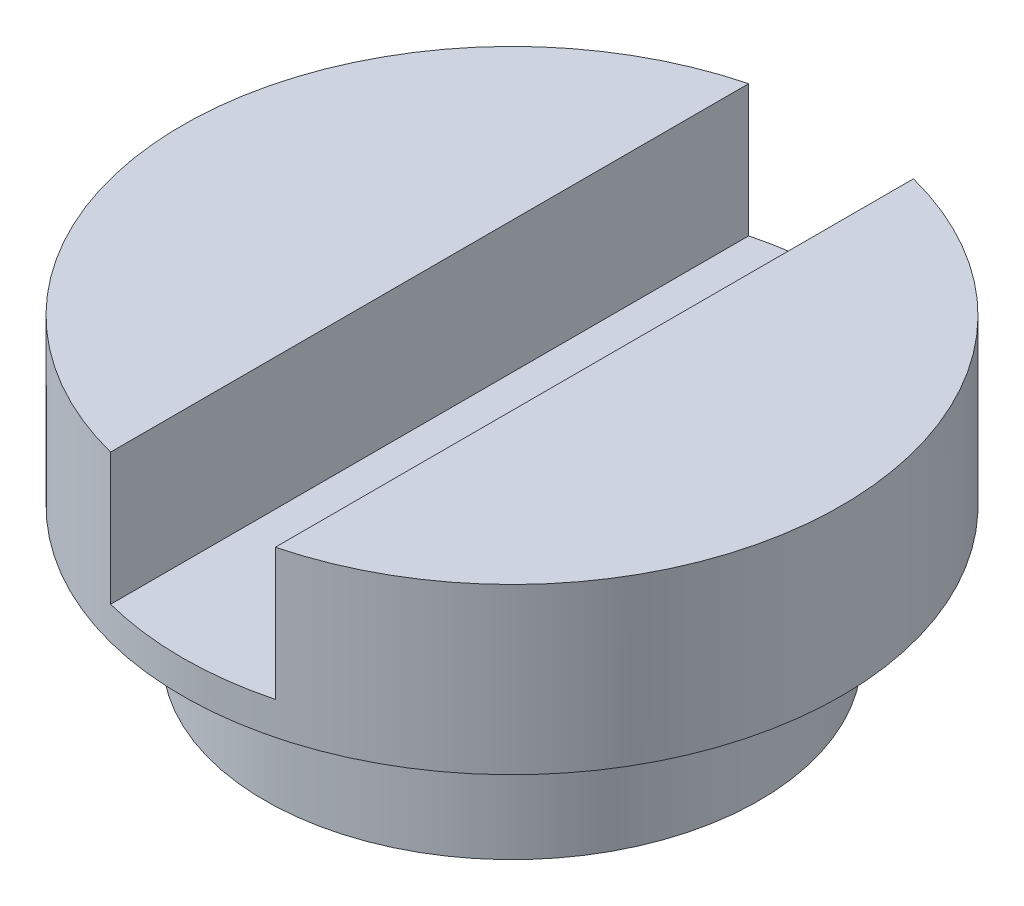
ISO-10303-21;
HEADER;
FILE_DESCRIPTION(('STEP AP214'),'2;1');
FILE_NAME('part.step','',(''),(''),'','','');
FILE_SCHEMA(('AUTOMOTIVE_DESIGN { 1 0 10303 214 1 1 1 1 }'));
ENDSEC;
DATA;
#1=APPLICATION_CONTEXT('core data for automotive mechanical design processes');
#2=APPLICATION_PROTOCOL_DEFINITION('international standard','automotive_design',2000,#1);
#3=PRODUCT_CONTEXT('',#1,'mechanical');
#4=PRODUCT('Part','Part','',(#3));
#5=PRODUCT_RELATED_PRODUCT_CATEGORY('part','',(#4));
#6=PRODUCT_DEFINITION_FORMATION('','',#4);
#7=PRODUCT_DEFINITION_CONTEXT('part definition',#1,'design');
#8=PRODUCT_DEFINITION('design','',#6,#7);
#9=PRODUCT_DEFINITION_SHAPE('','',#8);
#10=(LENGTH_UNIT() NAMED_UNIT(*) SI_UNIT(.MILLI.,.METRE.));
#11=(NAMED_UNIT(*) PLANE_ANGLE_UNIT() SI_UNIT($,.RADIAN.));
#12=(NAMED_UNIT(*) SI_UNIT($,.STERADIAN.) SOLID_ANGLE_UNIT());
#13=UNCERTAINTY_MEASURE_WITH_UNIT(LENGTH_MEASURE(1.E-05),#10,'distance_accuracy_value','');
#14=(GEOMETRIC_REPRESENTATION_CONTEXT(3) GLOBAL_UNCERTAINTY_ASSIGNED_CONTEXT((#13)) GLOBAL_UNIT_ASSIGNED_CONTEXT((#10,
#11,#12)) REPRESENTATION_CONTEXT('',''));
#15=CARTESIAN_POINT('',(0.,0.,0.));
#16=DIRECTION('',(0.,0.,1.));
#17=DIRECTION('',(1.,0.,0.));
#18=AXIS2_PLACEMENT_3D('',#15,#16,#17);
#19=CARTESIAN_POINT('',(174.151440709128,242.076649479877,536.449616024444));
#20=DIRECTION('',(0.,-1.,0.));
#21=DIRECTION('',(0.,0.,-1.));
#22=AXIS2_PLACEMENT_3D('',#19,#20,#21);
#23=PLANE('',#22);
#24=CARTESIAN_POINT('',(174.151440709128,242.076649479877,536.449616024444));
#25=DIRECTION('',(0.,-1.,0.));
#26=DIRECTION('',(0.,0.,-1.));
#27=AXIS2_PLACEMENT_3D('',#24,#25,#26);
#28=CIRCLE('',#27,12.7);
#29=CARTESIAN_POINT('',(174.151440709128,242.076649479877,523.749616024444));
#30=VERTEX_POINT('',#29);
#31=EDGE_CURVE('E11',#30,#30,#28,.T.);
#32=ORIENTED_EDGE('',*,*,#31,.T.);
#33=EDGE_LOOP('',(#32));
#34=FACE_BOUND('',#33,.T.);
#35=CARTESIAN_POINT('',(174.151440709128,242.076649479877,536.449616024444));
#36=DIRECTION('',(0.,-1.,0.));
#37=DIRECTION('',(0.,0.,-1.));
#38=AXIS2_PLACEMENT_3D('',#35,#36,#37);
#39=CIRCLE('',#38,9.52499999999999);
#40=CARTESIAN_POINT('',(174.151440709128,242.076649479877,526.924616024444));
#41=VERTEX_POINT('',#40);
#42=EDGE_CURVE('E137',#41,#41,#39,.T.);
#43=ORIENTED_EDGE('',*,*,#42,.F.);
#44=EDGE_LOOP('',(#43));
#45=FACE_BOUND('',#44,.T.);
#46=ADVANCED_FACE('F33',(#34,#45),#23,.T.);
#47=CARTESIAN_POINT('',(174.151440709128,243.346649479877,536.449616024444));
#48=DIRECTION('',(0.,-1.,0.));
#49=DIRECTION('',(0.,0.,-1.));
#50=AXIS2_PLACEMENT_3D('',#47,#48,#49);
#51=PLANE('',#50);
#52=DIRECTION('',(0.,0.,-1.));
#53=VECTOR('',#52,1.);
#54=CARTESIAN_POINT('',(170.976440709128,243.346649479877,548.746338148653));
#55=LINE('',#54,#53);
#56=CARTESIAN_POINT('',(170.976440709128,243.346649479877,548.746338148653));
#57=VERTEX_POINT('',#56);
#58=CARTESIAN_POINT('',(170.976440709128,243.346649479877,524.152893900236));
#59=VERTEX_POINT('',#58);
#60=EDGE_CURVE('E51',#57,#59,#55,.T.);
#61=ORIENTED_EDGE('',*,*,#60,.F.);
#62=CARTESIAN_POINT('',(174.151440709128,243.346649479877,536.449616024444));
#63=DIRECTION('',(0.,-1.,0.));
#64=DIRECTION('',(0.,0.,-1.));
#65=AXIS2_PLACEMENT_3D('',#62,#63,#64);
#66=CIRCLE('',#65,12.7);
#67=CARTESIAN_POINT('',(177.326440709128,243.346649479877,548.746338148653));
#68=VERTEX_POINT('',#67);
#69=EDGE_CURVE('E43',#68,#57,#66,.T.);
#70=ORIENTED_EDGE('',*,*,#69,.F.);
#71=DIRECTION('',(0.,0.,1.));
#72=VECTOR('',#71,1.);
#73=CARTESIAN_POINT('',(177.326440709128,243.346649479877,524.152893900236));
#74=LINE('',#73,#72);
#75=CARTESIAN_POINT('',(177.326440709128,243.346649479877,524.152893900236));
#76=VERTEX_POINT('',#75);
#77=EDGE_CURVE('E100',#76,#68,#74,.T.);
#78=ORIENTED_EDGE('',*,*,#77,.F.);
#79=EDGE_CURVE('E37',#59,#76,#66,.T.);
#80=ORIENTED_EDGE('',*,*,#79,.F.);
#81=EDGE_LOOP('',(#61,#70,#78,#80));
#82=FACE_BOUND('',#81,.T.);
#83=ADVANCED_FACE('F85',(#82),#51,.F.);
#84=CARTESIAN_POINT('',(174.151440709128,242.076649479877,536.449616024444));
#85=DIRECTION('',(0.,1.,0.));
#86=DIRECTION('',(0.,0.,1.));
#87=AXIS2_PLACEMENT_3D('',#84,#85,#86);
#88=CYLINDRICAL_SURFACE('',#87,12.7);
#89=ORIENTED_EDGE('',*,*,#69,.T.);
#90=DIRECTION('',(0.,-1.,0.));
#91=VECTOR('',#90,1.);
#92=CARTESIAN_POINT('',(170.976440709128,274.800180244642,548.746338148653));
#93=LINE('',#92,#91);
#94=CARTESIAN_POINT('',(170.976440709128,248.426649479877,548.746338148653));
#95=VERTEX_POINT('',#94);
#96=EDGE_CURVE('E77',#95,#57,#93,.T.);
#97=ORIENTED_EDGE('',*,*,#96,.F.);
#98=CARTESIAN_POINT('',(174.151440709128,248.426649479877,536.449616024444));
#99=DIRECTION('',(0.,-1.,0.));
#100=DIRECTION('',(0.,0.,-1.));
#101=AXIS2_PLACEMENT_3D('',#98,#99,#100);
#102=CIRCLE('',#101,12.7);
#103=CARTESIAN_POINT('',(170.976440709128,248.426649479877,524.152893900236));
#104=VERTEX_POINT('',#103);
#105=EDGE_CURVE('E105',#95,#104,#102,.T.);
#106=ORIENTED_EDGE('',*,*,#105,.T.);
#107=DIRECTION('',(0.,-1.,0.));
#108=VECTOR('',#107,1.);
#109=CARTESIAN_POINT('',(170.976440709128,274.800180244642,524.152893900236));
#110=LINE('',#109,#108);
#111=EDGE_CURVE('E82',#104,#59,#110,.T.);
#112=ORIENTED_EDGE('',*,*,#111,.T.);
#113=ORIENTED_EDGE('',*,*,#79,.T.);
#114=DIRECTION('',(0.,-1.,0.));
#115=VECTOR('',#114,1.);
#116=CARTESIAN_POINT('',(177.326440709128,274.800180244642,524.152893900236));
#117=LINE('',#116,#115);
#118=CARTESIAN_POINT('',(177.326440709128,248.426649479877,524.152893900236));
#119=VERTEX_POINT('',#118);
#120=EDGE_CURVE('E99',#119,#76,#117,.T.);
#121=ORIENTED_EDGE('',*,*,#120,.F.);
#122=CARTESIAN_POINT('',(174.151440709128,248.426649479877,536.449616024444));
#123=DIRECTION('',(0.,-1.,0.));
#124=DIRECTION('',(0.,0.,-1.));
#125=AXIS2_PLACEMENT_3D('',#122,#123,#124);
#126=CIRCLE('',#125,12.7);
#127=CARTESIAN_POINT('',(177.326440709128,248.426649479877,548.746338148653));
#128=VERTEX_POINT('',#127);
#129=EDGE_CURVE('E95',#119,#128,#126,.T.);
#130=ORIENTED_EDGE('',*,*,#129,.T.);
#131=DIRECTION('',(0.,-1.,0.));
#132=VECTOR('',#131,1.);
#133=CARTESIAN_POINT('',(177.326440709128,274.800180244642,548.746338148653));
#134=LINE('',#133,#132);
#135=EDGE_CURVE('E92',#128,#68,#134,.T.);
#136=ORIENTED_EDGE('',*,*,#135,.T.);
#137=EDGE_LOOP('',(#89,#97,#106,#112,#113,#121,#130,#136));
#138=FACE_BOUND('',#137,.T.);
#139=ORIENTED_EDGE('',*,*,#31,.F.);
#140=EDGE_LOOP('',(#139));
#141=FACE_BOUND('',#140,.T.);
#142=ADVANCED_FACE('F35',(#138,#141),#88,.T.);
#143=CARTESIAN_POINT('',(177.326440709128,274.800180244642,524.152893900236));
#144=DIRECTION('',(1.,0.,0.));
#145=DIRECTION('',(0.,0.,-1.));
#146=AXIS2_PLACEMENT_3D('',#143,#144,#145);
#147=PLANE('',#146);
#148=ORIENTED_EDGE('',*,*,#135,.F.);
#149=DIRECTION('',(0.,0.,-1.));
#150=VECTOR('',#149,1.);
#151=CARTESIAN_POINT('',(177.326440709128,248.426649479877,524.152893900236));
#152=LINE('',#151,#150);
#153=EDGE_CURVE('E110',#128,#119,#152,.T.);
#154=ORIENTED_EDGE('',*,*,#153,.T.);
#155=ORIENTED_EDGE('',*,*,#120,.T.);
#156=ORIENTED_EDGE('',*,*,#77,.T.);
#157=EDGE_LOOP('',(#148,#154,#155,#156));
#158=FACE_BOUND('',#157,.T.);
#159=ADVANCED_FACE('F114',(#158),#147,.F.);
#160=CARTESIAN_POINT('',(174.151440709128,248.426649479877,536.449616024444));
#161=DIRECTION('',(0.,-1.,0.));
#162=DIRECTION('',(-1.,0.,0.));
#163=AXIS2_PLACEMENT_3D('',#160,#161,#162);
#164=PLANE('',#163);
#165=ORIENTED_EDGE('',*,*,#153,.F.);
#166=ORIENTED_EDGE('',*,*,#129,.F.);
#167=EDGE_LOOP('',(#165,#166));
#168=FACE_BOUND('',#167,.T.);
#169=ADVANCED_FACE('F116',(#168),#164,.F.);
#170=CARTESIAN_POINT('',(170.976440709128,274.800180244642,548.746338148653));
#171=DIRECTION('',(-1.,0.,0.));
#172=DIRECTION('',(0.,0.,1.));
#173=AXIS2_PLACEMENT_3D('',#170,#171,#172);
#174=PLANE('',#173);
#175=ORIENTED_EDGE('',*,*,#111,.F.);
#176=DIRECTION('',(0.,0.,1.));
#177=VECTOR('',#176,1.);
#178=CARTESIAN_POINT('',(170.976440709128,248.426649479877,548.746338148653));
#179=LINE('',#178,#177);
#180=EDGE_CURVE('E79',#104,#95,#179,.T.);
#181=ORIENTED_EDGE('',*,*,#180,.T.);
#182=ORIENTED_EDGE('',*,*,#96,.T.);
#183=ORIENTED_EDGE('',*,*,#60,.T.);
#184=EDGE_LOOP('',(#175,#181,#182,#183));
#185=FACE_BOUND('',#184,.T.);
#186=ADVANCED_FACE('F78',(#185),#174,.F.);
#187=CARTESIAN_POINT('',(174.151440709128,248.426649479877,536.449616024444));
#188=DIRECTION('',(0.,-1.,0.));
#189=DIRECTION('',(-1.,0.,0.));
#190=AXIS2_PLACEMENT_3D('',#187,#188,#189);
#191=PLANE('',#190);
#192=ORIENTED_EDGE('',*,*,#180,.F.);
#193=ORIENTED_EDGE('',*,*,#105,.F.);
#194=EDGE_LOOP('',(#192,#193));
#195=FACE_BOUND('',#194,.T.);
#196=ADVANCED_FACE('F123',(#195),#191,.F.);
#197=CARTESIAN_POINT('',(174.151440709128,236.996649479877,536.449616024444));
#198=DIRECTION('',(0.,1.,0.));
#199=DIRECTION('',(0.,0.,1.));
#200=AXIS2_PLACEMENT_3D('',#197,#198,#199);
#201=CYLINDRICAL_SURFACE('',#200,9.52499999999999);
#202=CARTESIAN_POINT('',(174.151440709128,236.996649479877,536.449616024444));
#203=DIRECTION('',(0.,-1.,0.));
#204=DIRECTION('',(0.,0.,-1.));
#205=AXIS2_PLACEMENT_3D('',#202,#203,#204);
#206=CIRCLE('',#205,9.52499999999999);
#207=CARTESIAN_POINT('',(174.151440709128,236.996649479877,526.924616024444));
#208=VERTEX_POINT('',#207);
#209=EDGE_CURVE('E87',#208,#208,#206,.T.);
#210=ORIENTED_EDGE('',*,*,#209,.F.);
#211=EDGE_LOOP('',(#210));
#212=FACE_BOUND('',#211,.T.);
#213=ORIENTED_EDGE('',*,*,#42,.T.);
#214=EDGE_LOOP('',(#213));
#215=FACE_BOUND('',#214,.T.);
#216=ADVANCED_FACE('F159',(#212,#215),#201,.T.);
#217=CARTESIAN_POINT('',(174.151440709128,236.996649479877,536.449616024444));
#218=DIRECTION('',(0.,-1.,0.));
#219=DIRECTION('',(0.,0.,-1.));
#220=AXIS2_PLACEMENT_3D('',#217,#218,#219);
#221=PLANE('',#220);
#222=CARTESIAN_POINT('',(174.151440709128,236.996649479877,536.449616024444));
#223=DIRECTION('',(0.,-1.,0.));
#224=DIRECTION('',(0.,0.,-1.));
#225=AXIS2_PLACEMENT_3D('',#222,#223,#224);
#226=CIRCLE('',#225,2.85);
#227=CARTESIAN_POINT('',(174.151440709128,236.996649479877,533.599616024444));
#228=VERTEX_POINT('',#227);
#229=EDGE_CURVE('E139',#228,#228,#226,.T.);
#230=ORIENTED_EDGE('',*,*,#229,.F.);
#231=EDGE_LOOP('',(#230));
#232=FACE_BOUND('',#231,.T.);
#233=ORIENTED_EDGE('',*,*,#209,.T.);
#234=EDGE_LOOP('',(#233));
#235=FACE_BOUND('',#234,.T.);
#236=ADVANCED_FACE('F164',(#232,#235),#221,.T.);
#237=CARTESIAN_POINT('',(171.187440709128,241.846649479877,539.419792783191));
#238=DIRECTION('',(0.,1.,0.));
#239=DIRECTION('',(1.,0.,0.));
#240=AXIS2_PLACEMENT_3D('',#237,#238,#239);
#241=PLANE('',#240);
#242=CARTESIAN_POINT('',(174.151440709128,241.846649479877,536.449616024444));
#243=DIRECTION('',(0.,1.,0.));
#244=DIRECTION('',(1.,0.,0.));
#245=AXIS2_PLACEMENT_3D('',#242,#243,#244);
#246=CIRCLE('',#245,2.85);
#247=CARTESIAN_POINT('',(174.151440709128,241.846649479877,533.599616024444));
#248=VERTEX_POINT('',#247);
#249=EDGE_CURVE('E144',#248,#248,#246,.T.);
#250=ORIENTED_EDGE('',*,*,#249,.F.);
#251=EDGE_LOOP('',(#250));
#252=FACE_BOUND('',#251,.T.);
#253=ADVANCED_FACE('F170',(#252),#241,.F.);
#254=CARTESIAN_POINT('',(174.151440709128,249.907666785404,536.449616024444));
#255=DIRECTION('',(0.,-1.,0.));
#256=DIRECTION('',(0.,0.,-1.));
#257=AXIS2_PLACEMENT_3D('',#254,#255,#256);
#258=CYLINDRICAL_SURFACE('',#257,2.85);
#259=CARTESIAN_POINT('',(174.151440709128,236.996649479877,533.599616024444));
#260=CARTESIAN_POINT('',(174.151440709128,237.04717031321,533.599616024444));
#261=CARTESIAN_POINT('',(174.151440709128,237.097691146544,533.599616024444));
#262=CARTESIAN_POINT('',(174.151440709128,237.19873281321,533.599616024444));
#263=CARTESIAN_POINT('',(174.151440709128,237.249253646544,533.599616024444));
#264=CARTESIAN_POINT('',(174.151440709128,237.35029531321,533.599616024444));
#265=CARTESIAN_POINT('',(174.151440709128,237.400816146544,533.599616024444));
#266=CARTESIAN_POINT('',(174.151440709128,237.50185781321,533.599616024444));
#267=CARTESIAN_POINT('',(174.151440709128,237.552378646544,533.599616024444));
#268=CARTESIAN_POINT('',(174.151440709128,237.65342031321,533.599616024444));
#269=CARTESIAN_POINT('',(174.151440709128,237.703941146544,533.599616024444));
#270=CARTESIAN_POINT('',(174.151440709128,237.80498281321,533.599616024444));
#271=CARTESIAN_POINT('',(174.151440709128,237.855503646544,533.599616024444));
#272=CARTESIAN_POINT('',(174.151440709128,237.95654531321,533.599616024444));
#273=CARTESIAN_POINT('',(174.151440709128,238.007066146544,533.599616024444));
#274=CARTESIAN_POINT('',(174.151440709128,238.10810781321,533.599616024444));
#275=CARTESIAN_POINT('',(174.151440709128,238.158628646544,533.599616024444));
#276=CARTESIAN_POINT('',(174.151440709128,238.25967031321,533.599616024444));
#277=CARTESIAN_POINT('',(174.151440709128,238.310191146544,533.599616024444));
#278=CARTESIAN_POINT('',(174.151440709128,238.41123281321,533.599616024444));
#279=CARTESIAN_POINT('',(174.151440709128,238.461753646544,533.599616024444));
#280=CARTESIAN_POINT('',(174.151440709128,238.56279531321,533.599616024444));
#281=CARTESIAN_POINT('',(174.151440709128,238.613316146544,533.599616024444));
#282=CARTESIAN_POINT('',(174.151440709128,238.71435781321,533.599616024444));
#283=CARTESIAN_POINT('',(174.151440709128,238.764878646544,533.599616024444));
#284=CARTESIAN_POINT('',(174.151440709128,238.86592031321,533.599616024444));
#285=CARTESIAN_POINT('',(174.151440709128,238.916441146544,533.599616024444));
#286=CARTESIAN_POINT('',(174.151440709128,239.01748281321,533.599616024444));
#287=CARTESIAN_POINT('',(174.151440709128,239.068003646544,533.599616024444));
#288=CARTESIAN_POINT('',(174.151440709128,239.16904531321,533.599616024444));
#289=CARTESIAN_POINT('',(174.151440709128,239.219566146544,533.599616024444));
#290=CARTESIAN_POINT('',(174.151440709128,239.32060781321,533.599616024444));
#291=CARTESIAN_POINT('',(174.151440709128,239.371128646544,533.599616024444));
#292=CARTESIAN_POINT('',(174.151440709128,239.47217031321,533.599616024444));
#293=CARTESIAN_POINT('',(174.151440709128,239.522691146544,533.599616024444));
#294=CARTESIAN_POINT('',(174.151440709128,239.62373281321,533.599616024444));
#295=CARTESIAN_POINT('',(174.151440709128,239.674253646544,533.599616024444));
#296=CARTESIAN_POINT('',(174.151440709128,239.77529531321,533.599616024444));
#297=CARTESIAN_POINT('',(174.151440709128,239.825816146544,533.599616024444));
#298=CARTESIAN_POINT('',(174.151440709128,239.92685781321,533.599616024444));
#299=CARTESIAN_POINT('',(174.151440709128,239.977378646544,533.599616024444));
#300=CARTESIAN_POINT('',(174.151440709128,240.07842031321,533.599616024444));
#301=CARTESIAN_POINT('',(174.151440709128,240.128941146544,533.599616024444));
#302=CARTESIAN_POINT('',(174.151440709128,240.22998281321,533.599616024444));
#303=CARTESIAN_POINT('',(174.151440709128,240.280503646544,533.599616024444));
#304=CARTESIAN_POINT('',(174.151440709128,240.38154531321,533.599616024444));
#305=CARTESIAN_POINT('',(174.151440709128,240.432066146543,533.599616024444));
#306=CARTESIAN_POINT('',(174.151440709128,240.53310781321,533.599616024444));
#307=CARTESIAN_POINT('',(174.151440709128,240.583628646544,533.599616024444));
#308=CARTESIAN_POINT('',(174.151440709128,240.68467031321,533.599616024444));
#309=CARTESIAN_POINT('',(174.151440709128,240.735191146543,533.599616024444));
#310=CARTESIAN_POINT('',(174.151440709128,240.83623281321,533.599616024444));
#311=CARTESIAN_POINT('',(174.151440709128,240.886753646543,533.599616024444));
#312=CARTESIAN_POINT('',(174.151440709128,240.98779531321,533.599616024444));
#313=CARTESIAN_POINT('',(174.151440709128,241.038316146543,533.599616024444));
#314=CARTESIAN_POINT('',(174.151440709128,241.13935781321,533.599616024444));
#315=CARTESIAN_POINT('',(174.151440709128,241.189878646543,533.599616024444));
#316=CARTESIAN_POINT('',(174.151440709128,241.29092031321,533.599616024444));
#317=CARTESIAN_POINT('',(174.151440709128,241.341441146543,533.599616024444));
#318=CARTESIAN_POINT('',(174.151440709128,241.44248281321,533.599616024444));
#319=CARTESIAN_POINT('',(174.151440709128,241.493003646543,533.599616024444));
#320=CARTESIAN_POINT('',(174.151440709128,241.59404531321,533.599616024444));
#321=CARTESIAN_POINT('',(174.151440709128,241.644566146543,533.599616024444));
#322=CARTESIAN_POINT('',(174.151440709128,241.74560781321,533.599616024444));
#323=CARTESIAN_POINT('',(174.151440709128,241.796128646543,533.599616024444));
#324=CARTESIAN_POINT('',(174.151440709128,241.846649479877,533.599616024444));
#325=B_SPLINE_CURVE_WITH_KNOTS('',3,(#259,#260,#261,#262,#263,#264,#265,#266,#267,#268,#269,
#270,#271,#272,#273,#274,#275,#276,#277,#278,#279,#280,#281,#282,#283,#284,#285,#286,#287,#288,
#289,#290,#291,#292,#293,#294,#295,#296,#297,#298,#299,#300,#301,#302,#303,#304,#305,#306,#307,
#308,#309,#310,#311,#312,#313,#314,#315,#316,#317,#318,#319,#320,#321,#322,#323,#324),
.UNSPECIFIED.,.F.,.F.,(4,2,2,2,2,2,2,2,2,2,2,2,2,2,2,2,2,2,2,2,2,2,2,2,2,2,2,2,2,2,2,2,4),(0.,
0.151562500000008,0.303124999999987,0.454687499999995,0.606250000000003,0.757812499999982,
0.90937499999999,1.06093749999997,1.21249999999998,1.36406249999996,1.51562499999996,
1.66718749999994,1.81874999999995,1.97031249999993,2.12187499999994,2.27343749999992,
2.42499999999993,2.57656249999993,2.72812499999991,2.87968749999992,3.0312499999999,
3.18281249999991,3.33437499999989,3.4859374999999,3.63749999999988,3.78906249999988,
3.94062499999986,4.09218749999987,4.24374999999985,4.39531249999986,4.54687499999987,
4.69843749999985,4.84999999999985),.UNSPECIFIED.);
#326=EDGE_CURVE('BSEAM174',#228,#248,#325,.T.);
#327=ORIENTED_EDGE('',*,*,#229,.T.);
#328=ORIENTED_EDGE('',*,*,#249,.T.);
#329=ORIENTED_EDGE('',*,*,#326,.T.);
#330=ORIENTED_EDGE('',*,*,#326,.F.);
#331=EDGE_LOOP('',(#327,#329,#328,#330));
#332=FACE_BOUND('',#331,.T.);
#333=ADVANCED_FACE('F174',(#332),#258,.F.);
#334=CLOSED_SHELL('',(#46,#83,#142,#159,#169,#186,#196,#216,#236,#253,#333));
#335=MANIFOLD_SOLID_BREP('B2',#334);
#336=ADVANCED_BREP_SHAPE_REPRESENTATION('',(#18,#335),#14);
#337=SHAPE_DEFINITION_REPRESENTATION(#9,#336);
ENDSEC;
END-ISO-10303-21;
